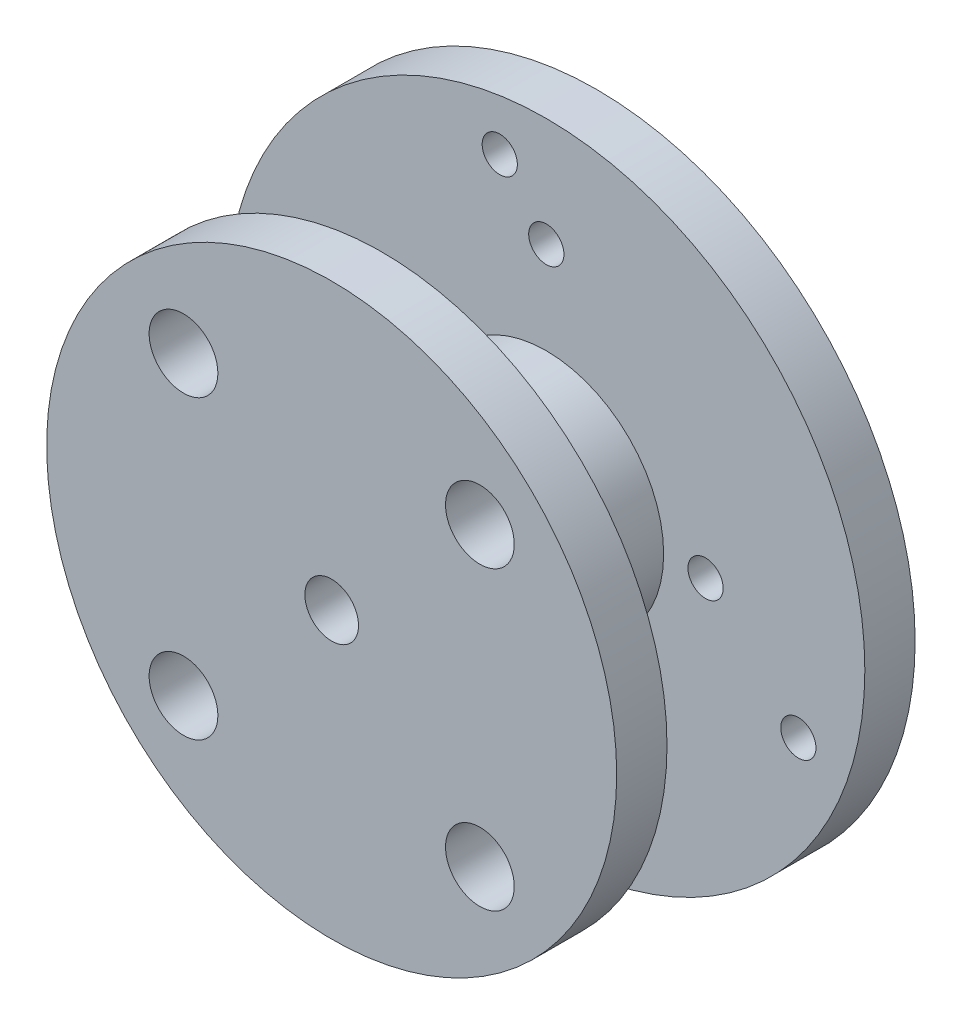
ISO-10303-21;
HEADER;
FILE_DESCRIPTION(('STEP AP214'),'2;1');
FILE_NAME('part.step','',(''),(''),'','','');
FILE_SCHEMA(('AUTOMOTIVE_DESIGN { 1 0 10303 214 1 1 1 1 }'));
ENDSEC;
DATA;
#1=APPLICATION_CONTEXT('core data for automotive mechanical design processes');
#2=APPLICATION_PROTOCOL_DEFINITION('international standard','automotive_design',2000,#1);
#3=PRODUCT_CONTEXT('',#1,'mechanical');
#4=PRODUCT('Part','Part','',(#3));
#5=PRODUCT_RELATED_PRODUCT_CATEGORY('part','',(#4));
#6=PRODUCT_DEFINITION_FORMATION('','',#4);
#7=PRODUCT_DEFINITION_CONTEXT('part definition',#1,'design');
#8=PRODUCT_DEFINITION('design','',#6,#7);
#9=PRODUCT_DEFINITION_SHAPE('','',#8);
#10=(LENGTH_UNIT() NAMED_UNIT(*) SI_UNIT(.MILLI.,.METRE.));
#11=(NAMED_UNIT(*) PLANE_ANGLE_UNIT() SI_UNIT($,.RADIAN.));
#12=(NAMED_UNIT(*) SI_UNIT($,.STERADIAN.) SOLID_ANGLE_UNIT());
#13=UNCERTAINTY_MEASURE_WITH_UNIT(LENGTH_MEASURE(1.E-05),#10,'distance_accuracy_value','');
#14=(GEOMETRIC_REPRESENTATION_CONTEXT(3) GLOBAL_UNCERTAINTY_ASSIGNED_CONTEXT((#13)) GLOBAL_UNIT_ASSIGNED_CONTEXT((#10,
#11,#12)) REPRESENTATION_CONTEXT('',''));
#15=CARTESIAN_POINT('',(0.,0.,0.));
#16=DIRECTION('',(0.,0.,1.));
#17=DIRECTION('',(1.,0.,0.));
#18=AXIS2_PLACEMENT_3D('',#15,#16,#17);
#19=CARTESIAN_POINT('',(0.,0.,3.));
#20=DIRECTION('',(0.,0.,-1.));
#21=DIRECTION('',(-1.,0.,0.));
#22=AXIS2_PLACEMENT_3D('',#19,#20,#21);
#23=CYLINDRICAL_SURFACE('',#22,19.);
#24=CARTESIAN_POINT('',(0.,0.,3.));
#25=DIRECTION('',(0.,0.,1.));
#26=DIRECTION('',(1.,0.,0.));
#27=AXIS2_PLACEMENT_3D('',#24,#25,#26);
#28=CIRCLE('',#27,19.);
#29=CARTESIAN_POINT('',(19.,0.,3.));
#30=VERTEX_POINT('',#29);
#31=EDGE_CURVE('E11',#30,#30,#28,.T.);
#32=ORIENTED_EDGE('',*,*,#31,.F.);
#33=EDGE_LOOP('',(#32));
#34=FACE_BOUND('',#33,.T.);
#35=CARTESIAN_POINT('',(0.,0.,0.));
#36=DIRECTION('',(0.,0.,1.));
#37=DIRECTION('',(1.,0.,0.));
#38=AXIS2_PLACEMENT_3D('',#35,#36,#37);
#39=CIRCLE('',#38,19.);
#40=CARTESIAN_POINT('',(19.,0.,0.));
#41=VERTEX_POINT('',#40);
#42=EDGE_CURVE('E42',#41,#41,#39,.T.);
#43=ORIENTED_EDGE('',*,*,#42,.T.);
#44=EDGE_LOOP('',(#43));
#45=FACE_BOUND('',#44,.T.);
#46=ADVANCED_FACE('F35',(#34,#45),#23,.T.);
#47=CARTESIAN_POINT('',(0.,0.,3.));
#48=DIRECTION('',(0.,0.,1.));
#49=DIRECTION('',(1.,0.,0.));
#50=AXIS2_PLACEMENT_3D('',#47,#48,#49);
#51=PLANE('',#50);
#52=CARTESIAN_POINT('',(0.,0.,3.));
#53=DIRECTION('',(0.,0.,1.));
#54=DIRECTION('',(1.,0.,0.));
#55=AXIS2_PLACEMENT_3D('',#52,#53,#54);
#56=CIRCLE('',#55,7.);
#57=CARTESIAN_POINT('',(7.,0.,3.));
#58=VERTEX_POINT('',#57);
#59=EDGE_CURVE('E68',#58,#58,#56,.T.);
#60=ORIENTED_EDGE('',*,*,#59,.F.);
#61=EDGE_LOOP('',(#60));
#62=FACE_BOUND('',#61,.T.);
#63=CARTESIAN_POINT('',(-12.2579698231466,-10.2831014686625,3.));
#64=DIRECTION('',(0.,0.,1.));
#65=DIRECTION('',(1.,0.,0.));
#66=AXIS2_PLACEMENT_3D('',#63,#64,#65);
#67=CIRCLE('',#66,1.05000000000124);
#68=CARTESIAN_POINT('',(-11.2079698231454,-10.2831014686625,3.));
#69=VERTEX_POINT('',#68);
#70=EDGE_CURVE('E73',#69,#69,#67,.T.);
#71=ORIENTED_EDGE('',*,*,#70,.F.);
#72=EDGE_LOOP('',(#71));
#73=FACE_BOUND('',#72,.T.);
#74=CARTESIAN_POINT('',(15.0344120131292,-5.47416253133719,3.));
#75=DIRECTION('',(0.,0.,1.));
#76=DIRECTION('',(1.,0.,0.));
#77=AXIS2_PLACEMENT_3D('',#74,#75,#76);
#78=CIRCLE('',#77,1.05000000000101);
#79=CARTESIAN_POINT('',(16.0844120131302,-5.47416253133719,3.));
#80=VERTEX_POINT('',#79);
#81=EDGE_CURVE('E86',#80,#80,#78,.T.);
#82=ORIENTED_EDGE('',*,*,#81,.F.);
#83=EDGE_LOOP('',(#82));
#84=FACE_BOUND('',#83,.T.);
#85=CARTESIAN_POINT('',(-2.77644218998055,15.757264,3.));
#86=DIRECTION('',(0.,0.,1.));
#87=DIRECTION('',(1.,0.,0.));
#88=AXIS2_PLACEMENT_3D('',#85,#86,#87);
#89=CIRCLE('',#88,1.05);
#90=CARTESIAN_POINT('',(-1.72644218998055,15.757264,3.));
#91=VERTEX_POINT('',#90);
#92=EDGE_CURVE('E80',#91,#91,#89,.T.);
#93=ORIENTED_EDGE('',*,*,#92,.F.);
#94=EDGE_LOOP('',(#93));
#95=FACE_BOUND('',#94,.T.);
#96=CARTESIAN_POINT('',(0.,-12.5,3.));
#97=DIRECTION('',(0.,0.,1.));
#98=DIRECTION('',(1.,0.,0.));
#99=AXIS2_PLACEMENT_3D('',#96,#97,#98);
#100=CIRCLE('',#99,1.05);
#101=CARTESIAN_POINT('',(1.05,-12.5,3.));
#102=VERTEX_POINT('',#101);
#103=EDGE_CURVE('E79',#102,#102,#100,.T.);
#104=ORIENTED_EDGE('',*,*,#103,.F.);
#105=EDGE_LOOP('',(#104));
#106=FACE_BOUND('',#105,.T.);
#107=CARTESIAN_POINT('',(9.5,0.,3.));
#108=DIRECTION('',(0.,0.,1.));
#109=DIRECTION('',(1.,0.,0.));
#110=AXIS2_PLACEMENT_3D('',#107,#108,#109);
#111=CIRCLE('',#110,1.05);
#112=CARTESIAN_POINT('',(10.55,0.,3.));
#113=VERTEX_POINT('',#112);
#114=EDGE_CURVE('E104',#113,#113,#111,.T.);
#115=ORIENTED_EDGE('',*,*,#114,.F.);
#116=EDGE_LOOP('',(#115));
#117=FACE_BOUND('',#116,.T.);
#118=CARTESIAN_POINT('',(-9.5,0.,3.));
#119=DIRECTION('',(0.,0.,1.));
#120=DIRECTION('',(1.,0.,0.));
#121=AXIS2_PLACEMENT_3D('',#118,#119,#120);
#122=CIRCLE('',#121,1.05);
#123=CARTESIAN_POINT('',(-8.45,0.,3.));
#124=VERTEX_POINT('',#123);
#125=EDGE_CURVE('E98',#124,#124,#122,.T.);
#126=ORIENTED_EDGE('',*,*,#125,.F.);
#127=EDGE_LOOP('',(#126));
#128=FACE_BOUND('',#127,.T.);
#129=CARTESIAN_POINT('',(0.,12.5,3.));
#130=DIRECTION('',(0.,0.,1.));
#131=DIRECTION('',(1.,0.,0.));
#132=AXIS2_PLACEMENT_3D('',#129,#130,#131);
#133=CIRCLE('',#132,1.05);
#134=CARTESIAN_POINT('',(1.05,12.5,3.));
#135=VERTEX_POINT('',#134);
#136=EDGE_CURVE('E97',#135,#135,#133,.T.);
#137=ORIENTED_EDGE('',*,*,#136,.F.);
#138=EDGE_LOOP('',(#137));
#139=FACE_BOUND('',#138,.T.);
#140=ORIENTED_EDGE('',*,*,#31,.T.);
#141=EDGE_LOOP('',(#140));
#142=FACE_BOUND('',#141,.T.);
#143=ADVANCED_FACE('F152',(#62,#73,#84,#95,#106,#117,#128,#139,#142),#51,.T.);
#144=CARTESIAN_POINT('',(0.,0.,0.));
#145=DIRECTION('',(0.,0.,1.));
#146=DIRECTION('',(1.,0.,0.));
#147=AXIS2_PLACEMENT_3D('',#144,#145,#146);
#148=PLANE('',#147);
#149=CARTESIAN_POINT('',(0.,0.,0.));
#150=DIRECTION('',(0.,0.,-1.));
#151=DIRECTION('',(-1.,0.,0.));
#152=AXIS2_PLACEMENT_3D('',#149,#150,#151);
#153=CIRCLE('',#152,3.);
#154=CARTESIAN_POINT('',(-3.,0.,0.));
#155=VERTEX_POINT('',#154);
#156=EDGE_CURVE('E122',#155,#155,#153,.T.);
#157=ORIENTED_EDGE('',*,*,#156,.F.);
#158=EDGE_LOOP('',(#157));
#159=FACE_BOUND('',#158,.T.);
#160=CARTESIAN_POINT('',(-12.2579698231466,-10.2831014686625,0.));
#161=DIRECTION('',(0.,0.,1.));
#162=DIRECTION('',(1.,0.,0.));
#163=AXIS2_PLACEMENT_3D('',#160,#161,#162);
#164=CIRCLE('',#163,1.05000000000124);
#165=CARTESIAN_POINT('',(-11.2079698231454,-10.2831014686625,0.));
#166=VERTEX_POINT('',#165);
#167=EDGE_CURVE('E89',#166,#166,#164,.T.);
#168=ORIENTED_EDGE('',*,*,#167,.T.);
#169=EDGE_LOOP('',(#168));
#170=FACE_BOUND('',#169,.T.);
#171=CARTESIAN_POINT('',(15.0344120131292,-5.47416253133719,0.));
#172=DIRECTION('',(0.,0.,1.));
#173=DIRECTION('',(1.,0.,0.));
#174=AXIS2_PLACEMENT_3D('',#171,#172,#173);
#175=CIRCLE('',#174,1.05000000000101);
#176=CARTESIAN_POINT('',(16.0844120131302,-5.47416253133719,0.));
#177=VERTEX_POINT('',#176);
#178=EDGE_CURVE('E83',#177,#177,#175,.T.);
#179=ORIENTED_EDGE('',*,*,#178,.T.);
#180=EDGE_LOOP('',(#179));
#181=FACE_BOUND('',#180,.T.);
#182=CARTESIAN_POINT('',(-2.77644218998055,15.757264,0.));
#183=DIRECTION('',(0.,0.,1.));
#184=DIRECTION('',(1.,0.,0.));
#185=AXIS2_PLACEMENT_3D('',#182,#183,#184);
#186=CIRCLE('',#185,1.05);
#187=CARTESIAN_POINT('',(-1.72644218998055,15.757264,0.));
#188=VERTEX_POINT('',#187);
#189=EDGE_CURVE('E76',#188,#188,#186,.T.);
#190=ORIENTED_EDGE('',*,*,#189,.T.);
#191=EDGE_LOOP('',(#190));
#192=FACE_BOUND('',#191,.T.);
#193=CARTESIAN_POINT('',(0.,-12.5,0.));
#194=DIRECTION('',(0.,0.,1.));
#195=DIRECTION('',(1.,0.,0.));
#196=AXIS2_PLACEMENT_3D('',#193,#194,#195);
#197=CIRCLE('',#196,1.05);
#198=CARTESIAN_POINT('',(1.05,-12.5,0.));
#199=VERTEX_POINT('',#198);
#200=EDGE_CURVE('E107',#199,#199,#197,.T.);
#201=ORIENTED_EDGE('',*,*,#200,.T.);
#202=EDGE_LOOP('',(#201));
#203=FACE_BOUND('',#202,.T.);
#204=CARTESIAN_POINT('',(9.5,0.,0.));
#205=DIRECTION('',(0.,0.,1.));
#206=DIRECTION('',(1.,0.,0.));
#207=AXIS2_PLACEMENT_3D('',#204,#205,#206);
#208=CIRCLE('',#207,1.05);
#209=CARTESIAN_POINT('',(10.55,0.,0.));
#210=VERTEX_POINT('',#209);
#211=EDGE_CURVE('E101',#210,#210,#208,.T.);
#212=ORIENTED_EDGE('',*,*,#211,.T.);
#213=EDGE_LOOP('',(#212));
#214=FACE_BOUND('',#213,.T.);
#215=CARTESIAN_POINT('',(-9.5,0.,0.));
#216=DIRECTION('',(0.,0.,1.));
#217=DIRECTION('',(1.,0.,0.));
#218=AXIS2_PLACEMENT_3D('',#215,#216,#217);
#219=CIRCLE('',#218,1.05);
#220=CARTESIAN_POINT('',(-8.45,0.,0.));
#221=VERTEX_POINT('',#220);
#222=EDGE_CURVE('E94',#221,#221,#219,.T.);
#223=ORIENTED_EDGE('',*,*,#222,.T.);
#224=EDGE_LOOP('',(#223));
#225=FACE_BOUND('',#224,.T.);
#226=CARTESIAN_POINT('',(0.,12.5,0.));
#227=DIRECTION('',(0.,0.,1.));
#228=DIRECTION('',(1.,0.,0.));
#229=AXIS2_PLACEMENT_3D('',#226,#227,#228);
#230=CIRCLE('',#229,1.05);
#231=CARTESIAN_POINT('',(1.05,12.5,0.));
#232=VERTEX_POINT('',#231);
#233=EDGE_CURVE('E112',#232,#232,#230,.T.);
#234=ORIENTED_EDGE('',*,*,#233,.T.);
#235=EDGE_LOOP('',(#234));
#236=FACE_BOUND('',#235,.T.);
#237=ORIENTED_EDGE('',*,*,#42,.F.);
#238=EDGE_LOOP('',(#237));
#239=FACE_BOUND('',#238,.T.);
#240=ADVANCED_FACE('F148',(#159,#170,#181,#192,#203,#214,#225,#236,#239),#148,.F.);
#241=CARTESIAN_POINT('',(0.,12.5,0.));
#242=DIRECTION('',(0.,0.,1.));
#243=DIRECTION('',(1.,0.,0.));
#244=AXIS2_PLACEMENT_3D('',#241,#242,#243);
#245=CYLINDRICAL_SURFACE('',#244,1.05);
#246=ORIENTED_EDGE('',*,*,#233,.F.);
#247=EDGE_LOOP('',(#246));
#248=FACE_BOUND('',#247,.T.);
#249=ORIENTED_EDGE('',*,*,#136,.T.);
#250=EDGE_LOOP('',(#249));
#251=FACE_BOUND('',#250,.T.);
#252=ADVANCED_FACE('F151',(#248,#251),#245,.F.);
#253=CARTESIAN_POINT('',(-9.5,0.,0.));
#254=DIRECTION('',(0.,0.,1.));
#255=DIRECTION('',(1.,0.,0.));
#256=AXIS2_PLACEMENT_3D('',#253,#254,#255);
#257=CYLINDRICAL_SURFACE('',#256,1.05);
#258=ORIENTED_EDGE('',*,*,#222,.F.);
#259=EDGE_LOOP('',(#258));
#260=FACE_BOUND('',#259,.T.);
#261=ORIENTED_EDGE('',*,*,#125,.T.);
#262=EDGE_LOOP('',(#261));
#263=FACE_BOUND('',#262,.T.);
#264=ADVANCED_FACE('F185',(#260,#263),#257,.F.);
#265=CARTESIAN_POINT('',(9.5,0.,0.));
#266=DIRECTION('',(0.,0.,1.));
#267=DIRECTION('',(1.,0.,0.));
#268=AXIS2_PLACEMENT_3D('',#265,#266,#267);
#269=CYLINDRICAL_SURFACE('',#268,1.05);
#270=ORIENTED_EDGE('',*,*,#211,.F.);
#271=EDGE_LOOP('',(#270));
#272=FACE_BOUND('',#271,.T.);
#273=ORIENTED_EDGE('',*,*,#114,.T.);
#274=EDGE_LOOP('',(#273));
#275=FACE_BOUND('',#274,.T.);
#276=ADVANCED_FACE('F191',(#272,#275),#269,.F.);
#277=CARTESIAN_POINT('',(0.,-12.5,0.));
#278=DIRECTION('',(0.,0.,1.));
#279=DIRECTION('',(1.,0.,0.));
#280=AXIS2_PLACEMENT_3D('',#277,#278,#279);
#281=CYLINDRICAL_SURFACE('',#280,1.05);
#282=ORIENTED_EDGE('',*,*,#200,.F.);
#283=EDGE_LOOP('',(#282));
#284=FACE_BOUND('',#283,.T.);
#285=ORIENTED_EDGE('',*,*,#103,.T.);
#286=EDGE_LOOP('',(#285));
#287=FACE_BOUND('',#286,.T.);
#288=ADVANCED_FACE('F187',(#284,#287),#281,.F.);
#289=CARTESIAN_POINT('',(-2.77644218998055,15.757264,0.));
#290=DIRECTION('',(0.,0.,1.));
#291=DIRECTION('',(1.,0.,0.));
#292=AXIS2_PLACEMENT_3D('',#289,#290,#291);
#293=CYLINDRICAL_SURFACE('',#292,1.05);
#294=ORIENTED_EDGE('',*,*,#189,.F.);
#295=EDGE_LOOP('',(#294));
#296=FACE_BOUND('',#295,.T.);
#297=ORIENTED_EDGE('',*,*,#92,.T.);
#298=EDGE_LOOP('',(#297));
#299=FACE_BOUND('',#298,.T.);
#300=ADVANCED_FACE('F190',(#296,#299),#293,.F.);
#301=CARTESIAN_POINT('',(15.0344120131292,-5.47416253133719,0.));
#302=DIRECTION('',(0.,0.,1.));
#303=DIRECTION('',(1.,0.,0.));
#304=AXIS2_PLACEMENT_3D('',#301,#302,#303);
#305=CYLINDRICAL_SURFACE('',#304,1.05000000000101);
#306=ORIENTED_EDGE('',*,*,#178,.F.);
#307=EDGE_LOOP('',(#306));
#308=FACE_BOUND('',#307,.T.);
#309=ORIENTED_EDGE('',*,*,#81,.T.);
#310=EDGE_LOOP('',(#309));
#311=FACE_BOUND('',#310,.T.);
#312=ADVANCED_FACE('F203',(#308,#311),#305,.F.);
#313=CARTESIAN_POINT('',(-12.2579698231466,-10.2831014686625,0.));
#314=DIRECTION('',(0.,0.,1.));
#315=DIRECTION('',(1.,0.,0.));
#316=AXIS2_PLACEMENT_3D('',#313,#314,#315);
#317=CYLINDRICAL_SURFACE('',#316,1.05000000000124);
#318=ORIENTED_EDGE('',*,*,#167,.F.);
#319=EDGE_LOOP('',(#318));
#320=FACE_BOUND('',#319,.T.);
#321=ORIENTED_EDGE('',*,*,#70,.T.);
#322=EDGE_LOOP('',(#321));
#323=FACE_BOUND('',#322,.T.);
#324=ADVANCED_FACE('F199',(#320,#323),#317,.F.);
#325=CARTESIAN_POINT('',(0.,0.,12.8));
#326=DIRECTION('',(0.,0.,-1.));
#327=DIRECTION('',(-1.,0.,0.));
#328=AXIS2_PLACEMENT_3D('',#325,#326,#327);
#329=CYLINDRICAL_SURFACE('',#328,7.);
#330=CARTESIAN_POINT('',(0.,0.,12.8));
#331=DIRECTION('',(0.,0.,1.));
#332=DIRECTION('',(1.,0.,0.));
#333=AXIS2_PLACEMENT_3D('',#330,#331,#332);
#334=CIRCLE('',#333,7.);
#335=CARTESIAN_POINT('',(7.,0.,12.8));
#336=VERTEX_POINT('',#335);
#337=EDGE_CURVE('E70',#336,#336,#334,.T.);
#338=ORIENTED_EDGE('',*,*,#337,.F.);
#339=EDGE_LOOP('',(#338));
#340=FACE_BOUND('',#339,.T.);
#341=ORIENTED_EDGE('',*,*,#59,.T.);
#342=EDGE_LOOP('',(#341));
#343=FACE_BOUND('',#342,.T.);
#344=ADVANCED_FACE('F202',(#340,#343),#329,.T.);
#345=CARTESIAN_POINT('',(0.,0.,15.8));
#346=DIRECTION('',(0.,0.,-1.));
#347=DIRECTION('',(-1.,0.,0.));
#348=AXIS2_PLACEMENT_3D('',#345,#346,#347);
#349=CYLINDRICAL_SURFACE('',#348,17.);
#350=CARTESIAN_POINT('',(0.,0.,15.8));
#351=DIRECTION('',(0.,0.,1.));
#352=DIRECTION('',(1.,0.,0.));
#353=AXIS2_PLACEMENT_3D('',#350,#351,#352);
#354=CIRCLE('',#353,17.);
#355=CARTESIAN_POINT('',(17.,0.,15.8));
#356=VERTEX_POINT('',#355);
#357=EDGE_CURVE('E60',#356,#356,#354,.T.);
#358=ORIENTED_EDGE('',*,*,#357,.F.);
#359=EDGE_LOOP('',(#358));
#360=FACE_BOUND('',#359,.T.);
#361=CARTESIAN_POINT('',(0.,0.,12.8));
#362=DIRECTION('',(0.,0.,1.));
#363=DIRECTION('',(1.,0.,0.));
#364=AXIS2_PLACEMENT_3D('',#361,#362,#363);
#365=CIRCLE('',#364,17.);
#366=CARTESIAN_POINT('',(17.,0.,12.8));
#367=VERTEX_POINT('',#366);
#368=EDGE_CURVE('E56',#367,#367,#365,.T.);
#369=ORIENTED_EDGE('',*,*,#368,.T.);
#370=EDGE_LOOP('',(#369));
#371=FACE_BOUND('',#370,.T.);
#372=ADVANCED_FACE('F213',(#360,#371),#349,.T.);
#373=CARTESIAN_POINT('',(0.,0.,15.8));
#374=DIRECTION('',(0.,0.,1.));
#375=DIRECTION('',(1.,0.,0.));
#376=AXIS2_PLACEMENT_3D('',#373,#374,#375);
#377=PLANE('',#376);
#378=CARTESIAN_POINT('',(8.83883476483232,-8.83883476483186,15.8));
#379=DIRECTION('',(0.,0.,1.));
#380=DIRECTION('',(1.,0.,0.));
#381=AXIS2_PLACEMENT_3D('',#378,#379,#380);
#382=CIRCLE('',#381,2.04999999999988);
#383=CARTESIAN_POINT('',(10.8888347648322,-8.83883476483186,15.8));
#384=VERTEX_POINT('',#383);
#385=EDGE_CURVE('E127',#384,#384,#382,.T.);
#386=ORIENTED_EDGE('',*,*,#385,.F.);
#387=EDGE_LOOP('',(#386));
#388=FACE_BOUND('',#387,.T.);
#389=CARTESIAN_POINT('',(-8.83883476483136,-8.83883476483232,15.8));
#390=DIRECTION('',(0.,0.,1.));
#391=DIRECTION('',(1.,0.,0.));
#392=AXIS2_PLACEMENT_3D('',#389,#390,#391);
#393=CIRCLE('',#392,2.05000000000038);
#394=CARTESIAN_POINT('',(-6.78883476483098,-8.83883476483232,15.8));
#395=VERTEX_POINT('',#394);
#396=EDGE_CURVE('E252',#395,#395,#393,.T.);
#397=ORIENTED_EDGE('',*,*,#396,.F.);
#398=EDGE_LOOP('',(#397));
#399=FACE_BOUND('',#398,.T.);
#400=CARTESIAN_POINT('',(-8.83883476483183,8.83883476483136,15.8));
#401=DIRECTION('',(0.,0.,1.));
#402=DIRECTION('',(1.,0.,0.));
#403=AXIS2_PLACEMENT_3D('',#400,#401,#402);
#404=CIRCLE('',#403,2.05000000000054);
#405=CARTESIAN_POINT('',(-6.78883476483129,8.83883476483136,15.8));
#406=VERTEX_POINT('',#405);
#407=EDGE_CURVE('E140',#406,#406,#404,.T.);
#408=ORIENTED_EDGE('',*,*,#407,.F.);
#409=EDGE_LOOP('',(#408));
#410=FACE_BOUND('',#409,.T.);
#411=CARTESIAN_POINT('',(8.83883476483186,8.83883476483183,15.8));
#412=DIRECTION('',(0.,0.,1.));
#413=DIRECTION('',(1.,0.,0.));
#414=AXIS2_PLACEMENT_3D('',#411,#412,#413);
#415=CIRCLE('',#414,2.05);
#416=CARTESIAN_POINT('',(10.8888347648319,8.83883476483183,15.8));
#417=VERTEX_POINT('',#416);
#418=EDGE_CURVE('E123',#417,#417,#415,.T.);
#419=ORIENTED_EDGE('',*,*,#418,.F.);
#420=EDGE_LOOP('',(#419));
#421=FACE_BOUND('',#420,.T.);
#422=CARTESIAN_POINT('',(0.,0.,15.8));
#423=DIRECTION('',(0.,0.,1.));
#424=DIRECTION('',(1.,0.,0.));
#425=AXIS2_PLACEMENT_3D('',#422,#423,#424);
#426=CIRCLE('',#425,1.59999999999999);
#427=CARTESIAN_POINT('',(1.59999999999999,0.,15.8));
#428=VERTEX_POINT('',#427);
#429=EDGE_CURVE('E57',#428,#428,#426,.T.);
#430=ORIENTED_EDGE('',*,*,#429,.F.);
#431=EDGE_LOOP('',(#430));
#432=FACE_BOUND('',#431,.T.);
#433=ORIENTED_EDGE('',*,*,#357,.T.);
#434=EDGE_LOOP('',(#433));
#435=FACE_BOUND('',#434,.T.);
#436=ADVANCED_FACE('F217',(#388,#399,#410,#421,#432,#435),#377,.T.);
#437=CARTESIAN_POINT('',(0.,0.,12.8));
#438=DIRECTION('',(0.,0.,1.));
#439=DIRECTION('',(1.,0.,0.));
#440=AXIS2_PLACEMENT_3D('',#437,#438,#439);
#441=PLANE('',#440);
#442=CARTESIAN_POINT('',(8.83883476483232,-8.83883476483186,12.8));
#443=DIRECTION('',(0.,0.,1.));
#444=DIRECTION('',(1.,0.,0.));
#445=AXIS2_PLACEMENT_3D('',#442,#443,#444);
#446=CIRCLE('',#445,2.04999999999988);
#447=CARTESIAN_POINT('',(10.8888347648322,-8.83883476483186,12.8));
#448=VERTEX_POINT('',#447);
#449=EDGE_CURVE('E38',#448,#448,#446,.T.);
#450=ORIENTED_EDGE('',*,*,#449,.T.);
#451=EDGE_LOOP('',(#450));
#452=FACE_BOUND('',#451,.T.);
#453=CARTESIAN_POINT('',(-8.83883476483136,-8.83883476483232,12.8));
#454=DIRECTION('',(0.,0.,1.));
#455=DIRECTION('',(1.,0.,0.));
#456=AXIS2_PLACEMENT_3D('',#453,#454,#455);
#457=CIRCLE('',#456,2.05000000000038);
#458=CARTESIAN_POINT('',(-6.78883476483098,-8.83883476483232,12.8));
#459=VERTEX_POINT('',#458);
#460=EDGE_CURVE('E126',#459,#459,#457,.T.);
#461=ORIENTED_EDGE('',*,*,#460,.T.);
#462=EDGE_LOOP('',(#461));
#463=FACE_BOUND('',#462,.T.);
#464=CARTESIAN_POINT('',(-8.83883476483183,8.83883476483136,12.8));
#465=DIRECTION('',(0.,0.,1.));
#466=DIRECTION('',(1.,0.,0.));
#467=AXIS2_PLACEMENT_3D('',#464,#465,#466);
#468=CIRCLE('',#467,2.05000000000054);
#469=CARTESIAN_POINT('',(-6.78883476483129,8.83883476483136,12.8));
#470=VERTEX_POINT('',#469);
#471=EDGE_CURVE('E124',#470,#470,#468,.T.);
#472=ORIENTED_EDGE('',*,*,#471,.T.);
#473=EDGE_LOOP('',(#472));
#474=FACE_BOUND('',#473,.T.);
#475=CARTESIAN_POINT('',(8.83883476483186,8.83883476483183,12.8));
#476=DIRECTION('',(0.,0.,1.));
#477=DIRECTION('',(1.,0.,0.));
#478=AXIS2_PLACEMENT_3D('',#475,#476,#477);
#479=CIRCLE('',#478,2.05);
#480=CARTESIAN_POINT('',(10.8888347648319,8.83883476483183,12.8));
#481=VERTEX_POINT('',#480);
#482=EDGE_CURVE('E119',#481,#481,#479,.T.);
#483=ORIENTED_EDGE('',*,*,#482,.T.);
#484=EDGE_LOOP('',(#483));
#485=FACE_BOUND('',#484,.T.);
#486=ORIENTED_EDGE('',*,*,#337,.T.);
#487=EDGE_LOOP('',(#486));
#488=FACE_BOUND('',#487,.T.);
#489=ORIENTED_EDGE('',*,*,#368,.F.);
#490=EDGE_LOOP('',(#489));
#491=FACE_BOUND('',#490,.T.);
#492=ADVANCED_FACE('F50',(#452,#463,#474,#485,#488,#491),#441,.F.);
#493=CARTESIAN_POINT('',(0.,0.,9.8));
#494=DIRECTION('',(0.,0.,1.));
#495=DIRECTION('',(1.,0.,0.));
#496=AXIS2_PLACEMENT_3D('',#493,#494,#495);
#497=CONICAL_SURFACE('',#496,1.6,1.02974425867665);
#498=CARTESIAN_POINT('',(0.,0.,8.8386230095559));
#499=VERTEX_POINT('',#498);
#500=VERTEX_LOOP('',#499);
#501=FACE_BOUND('',#500,.T.);
#502=CARTESIAN_POINT('',(0.,0.,9.8));
#503=DIRECTION('',(0.,0.,1.));
#504=DIRECTION('',(1.,0.,0.));
#505=AXIS2_PLACEMENT_3D('',#502,#503,#504);
#506=CIRCLE('',#505,1.6);
#507=CARTESIAN_POINT('',(1.6,0.,9.8));
#508=VERTEX_POINT('',#507);
#509=EDGE_CURVE('E54',#508,#508,#506,.T.);
#510=ORIENTED_EDGE('',*,*,#509,.T.);
#511=EDGE_LOOP('',(#510));
#512=FACE_BOUND('',#511,.T.);
#513=ADVANCED_FACE('F46',(#501,#512),#497,.F.);
#514=CARTESIAN_POINT('',(0.,0.,15.8));
#515=DIRECTION('',(0.,0.,1.));
#516=DIRECTION('',(1.,0.,0.));
#517=AXIS2_PLACEMENT_3D('',#514,#515,#516);
#518=CYLINDRICAL_SURFACE('',#517,1.59999999999999);
#519=ORIENTED_EDGE('',*,*,#509,.F.);
#520=EDGE_LOOP('',(#519));
#521=FACE_BOUND('',#520,.T.);
#522=ORIENTED_EDGE('',*,*,#429,.T.);
#523=EDGE_LOOP('',(#522));
#524=FACE_BOUND('',#523,.T.);
#525=ADVANCED_FACE('F49',(#521,#524),#518,.F.);
#526=CARTESIAN_POINT('',(0.,0.,4.));
#527=DIRECTION('',(0.,0.,-1.));
#528=DIRECTION('',(-1.,0.,0.));
#529=AXIS2_PLACEMENT_3D('',#526,#527,#528);
#530=CYLINDRICAL_SURFACE('',#529,3.);
#531=CARTESIAN_POINT('',(0.,0.,4.));
#532=DIRECTION('',(0.,0.,-1.));
#533=DIRECTION('',(-1.,0.,0.));
#534=AXIS2_PLACEMENT_3D('',#531,#532,#533);
#535=CIRCLE('',#534,3.);
#536=CARTESIAN_POINT('',(-3.,0.,4.));
#537=VERTEX_POINT('',#536);
#538=EDGE_CURVE('E63',#537,#537,#535,.T.);
#539=ORIENTED_EDGE('',*,*,#538,.F.);
#540=EDGE_LOOP('',(#539));
#541=FACE_BOUND('',#540,.T.);
#542=ORIENTED_EDGE('',*,*,#156,.T.);
#543=EDGE_LOOP('',(#542));
#544=FACE_BOUND('',#543,.T.);
#545=ADVANCED_FACE('F146',(#541,#544),#530,.F.);
#546=CARTESIAN_POINT('',(0.,0.,4.));
#547=DIRECTION('',(0.,0.,-1.));
#548=DIRECTION('',(-1.,0.,0.));
#549=AXIS2_PLACEMENT_3D('',#546,#547,#548);
#550=PLANE('',#549);
#551=ORIENTED_EDGE('',*,*,#538,.T.);
#552=EDGE_LOOP('',(#551));
#553=FACE_BOUND('',#552,.T.);
#554=ADVANCED_FACE('F228',(#553),#550,.T.);
#555=CARTESIAN_POINT('',(8.83883476483186,8.83883476483183,11.8));
#556=DIRECTION('',(0.,0.,1.));
#557=DIRECTION('',(1.,0.,0.));
#558=AXIS2_PLACEMENT_3D('',#555,#556,#557);
#559=CYLINDRICAL_SURFACE('',#558,2.05);
#560=ORIENTED_EDGE('',*,*,#418,.T.);
#561=EDGE_LOOP('',(#560));
#562=FACE_BOUND('',#561,.T.);
#563=ORIENTED_EDGE('',*,*,#482,.F.);
#564=EDGE_LOOP('',(#563));
#565=FACE_BOUND('',#564,.T.);
#566=ADVANCED_FACE('F232',(#562,#565),#559,.F.);
#567=CARTESIAN_POINT('',(-8.83883476483183,8.83883476483136,11.8));
#568=DIRECTION('',(0.,0.,1.));
#569=DIRECTION('',(1.,0.,0.));
#570=AXIS2_PLACEMENT_3D('',#567,#568,#569);
#571=CYLINDRICAL_SURFACE('',#570,2.05000000000054);
#572=ORIENTED_EDGE('',*,*,#407,.T.);
#573=EDGE_LOOP('',(#572));
#574=FACE_BOUND('',#573,.T.);
#575=ORIENTED_EDGE('',*,*,#471,.F.);
#576=EDGE_LOOP('',(#575));
#577=FACE_BOUND('',#576,.T.);
#578=ADVANCED_FACE('F236',(#574,#577),#571,.F.);
#579=CARTESIAN_POINT('',(-8.83883476483136,-8.83883476483232,11.8));
#580=DIRECTION('',(0.,0.,1.));
#581=DIRECTION('',(1.,0.,0.));
#582=AXIS2_PLACEMENT_3D('',#579,#580,#581);
#583=CYLINDRICAL_SURFACE('',#582,2.05000000000038);
#584=ORIENTED_EDGE('',*,*,#396,.T.);
#585=EDGE_LOOP('',(#584));
#586=FACE_BOUND('',#585,.T.);
#587=ORIENTED_EDGE('',*,*,#460,.F.);
#588=EDGE_LOOP('',(#587));
#589=FACE_BOUND('',#588,.T.);
#590=ADVANCED_FACE('F239',(#586,#589),#583,.F.);
#591=CARTESIAN_POINT('',(8.83883476483232,-8.83883476483186,11.8));
#592=DIRECTION('',(0.,0.,1.));
#593=DIRECTION('',(1.,0.,0.));
#594=AXIS2_PLACEMENT_3D('',#591,#592,#593);
#595=CYLINDRICAL_SURFACE('',#594,2.04999999999988);
#596=ORIENTED_EDGE('',*,*,#385,.T.);
#597=EDGE_LOOP('',(#596));
#598=FACE_BOUND('',#597,.T.);
#599=ORIENTED_EDGE('',*,*,#449,.F.);
#600=EDGE_LOOP('',(#599));
#601=FACE_BOUND('',#600,.T.);
#602=ADVANCED_FACE('F243',(#598,#601),#595,.F.);
#603=CLOSED_SHELL('',(#46,#143,#240,#252,#264,#276,#288,#300,#312,#324,#344,#372,#436,#492,#513,
#525,#545,#554,#566,#578,#590,#602));
#604=MANIFOLD_SOLID_BREP('B2',#603);
#605=ADVANCED_BREP_SHAPE_REPRESENTATION('',(#18,#604),#14);
#606=SHAPE_DEFINITION_REPRESENTATION(#9,#605);
ENDSEC;
END-ISO-10303-21;
